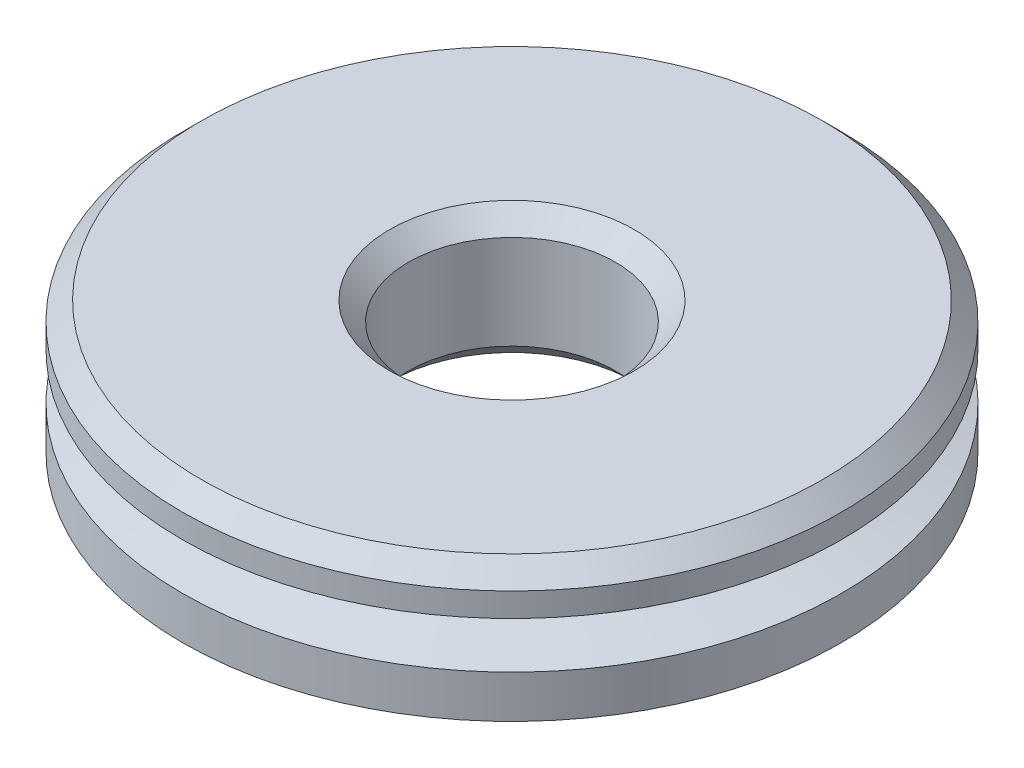
ISO-10303-21;
HEADER;
FILE_DESCRIPTION(('STEP AP214'),'2;1');
FILE_NAME('part.step','',(''),(''),'','','');
FILE_SCHEMA(('AUTOMOTIVE_DESIGN { 1 0 10303 214 1 1 1 1 }'));
ENDSEC;
DATA;
#1=APPLICATION_CONTEXT('core data for automotive mechanical design processes');
#2=APPLICATION_PROTOCOL_DEFINITION('international standard','automotive_design',2000,#1);
#3=PRODUCT_CONTEXT('',#1,'mechanical');
#4=PRODUCT('Part','Part','',(#3));
#5=PRODUCT_RELATED_PRODUCT_CATEGORY('part','',(#4));
#6=PRODUCT_DEFINITION_FORMATION('','',#4);
#7=PRODUCT_DEFINITION_CONTEXT('part definition',#1,'design');
#8=PRODUCT_DEFINITION('design','',#6,#7);
#9=PRODUCT_DEFINITION_SHAPE('','',#8);
#10=(LENGTH_UNIT() NAMED_UNIT(*) SI_UNIT(.MILLI.,.METRE.));
#11=(NAMED_UNIT(*) PLANE_ANGLE_UNIT() SI_UNIT($,.RADIAN.));
#12=(NAMED_UNIT(*) SI_UNIT($,.STERADIAN.) SOLID_ANGLE_UNIT());
#13=UNCERTAINTY_MEASURE_WITH_UNIT(LENGTH_MEASURE(1.E-05),#10,'distance_accuracy_value','');
#14=(GEOMETRIC_REPRESENTATION_CONTEXT(3) GLOBAL_UNCERTAINTY_ASSIGNED_CONTEXT((#13)) GLOBAL_UNIT_ASSIGNED_CONTEXT((#10,
#11,#12)) REPRESENTATION_CONTEXT('',''));
#15=CARTESIAN_POINT('',(0.,0.,0.));
#16=DIRECTION('',(0.,0.,1.));
#17=DIRECTION('',(1.,0.,0.));
#18=AXIS2_PLACEMENT_3D('',#15,#16,#17);
#19=CARTESIAN_POINT('',(-16.51,9.48098945053343,0.));
#20=DIRECTION('',(0.,1.,0.));
#21=DIRECTION('',(0.,0.,1.));
#22=AXIS2_PLACEMENT_3D('',#19,#20,#21);
#23=CONICAL_SURFACE('',#22,44.45,1.30899693899575);
#24=CARTESIAN_POINT('',(-16.51,6.35,0.));
#25=DIRECTION('',(0.,1.,0.));
#26=DIRECTION('',(0.,0.,1.));
#27=AXIS2_PLACEMENT_3D('',#24,#25,#26);
#28=CIRCLE('',#27,32.7649882926469);
#29=CARTESIAN_POINT('',(-16.51,6.35,32.7649882926469));
#30=VERTEX_POINT('',#29);
#31=EDGE_CURVE('E77',#30,#30,#28,.T.);
#32=ORIENTED_EDGE('',*,*,#31,.T.);
#33=EDGE_LOOP('',(#32));
#34=FACE_BOUND('',#33,.T.);
#35=CARTESIAN_POINT('',(-16.51,9.48098945053343,0.));
#36=DIRECTION('',(0.,1.,0.));
#37=DIRECTION('',(0.,0.,1.));
#38=AXIS2_PLACEMENT_3D('',#35,#36,#37);
#39=CIRCLE('',#38,44.45);
#40=CARTESIAN_POINT('',(-16.51,9.48098945053343,44.45));
#41=VERTEX_POINT('',#40);
#42=EDGE_CURVE('E68',#41,#41,#39,.T.);
#43=ORIENTED_EDGE('',*,*,#42,.F.);
#44=EDGE_LOOP('',(#43));
#45=FACE_BOUND('',#44,.T.);
#46=ADVANCED_FACE('F45',(#34,#45),#23,.T.);
#47=CARTESIAN_POINT('',(-16.51,12.7,0.));
#48=DIRECTION('',(0.,1.,0.));
#49=DIRECTION('',(0.,0.,1.));
#50=AXIS2_PLACEMENT_3D('',#47,#48,#49);
#51=CYLINDRICAL_SURFACE('',#50,44.45);
#52=CARTESIAN_POINT('',(-16.51,12.6999999999999,0.));
#53=DIRECTION('',(0.,-1.,0.));
#54=DIRECTION('',(0.,0.,-1.));
#55=AXIS2_PLACEMENT_3D('',#52,#53,#54);
#56=CIRCLE('',#55,44.45);
#57=CARTESIAN_POINT('',(-16.51,12.6999999999999,-44.45));
#58=VERTEX_POINT('',#57);
#59=EDGE_CURVE('E59',#58,#58,#56,.T.);
#60=ORIENTED_EDGE('',*,*,#59,.T.);
#61=EDGE_LOOP('',(#60));
#62=FACE_BOUND('',#61,.T.);
#63=ORIENTED_EDGE('',*,*,#42,.T.);
#64=EDGE_LOOP('',(#63));
#65=FACE_BOUND('',#64,.T.);
#66=ADVANCED_FACE('F153',(#62,#65),#51,.T.);
#67=CARTESIAN_POINT('',(0.,15.24,0.));
#68=DIRECTION('',(0.,-1.,0.));
#69=DIRECTION('',(0.,0.,-1.));
#70=AXIS2_PLACEMENT_3D('',#67,#68,#69);
#71=PLANE('',#70);
#72=CARTESIAN_POINT('',(-16.51,15.24,0.));
#73=DIRECTION('',(0.,-1.,0.));
#74=DIRECTION('',(0.,0.,-1.));
#75=AXIS2_PLACEMENT_3D('',#72,#73,#74);
#76=CIRCLE('',#75,41.9099999999999);
#77=CARTESIAN_POINT('',(-16.51,15.24,-41.9099999999999));
#78=VERTEX_POINT('',#77);
#79=EDGE_CURVE('E62',#78,#78,#76,.F.);
#80=ORIENTED_EDGE('',*,*,#79,.T.);
#81=EDGE_LOOP('',(#80));
#82=FACE_BOUND('',#81,.T.);
#83=CARTESIAN_POINT('',(-16.51,15.24,0.));
#84=DIRECTION('',(0.,-1.,0.));
#85=DIRECTION('',(0.,0.,-1.));
#86=AXIS2_PLACEMENT_3D('',#83,#84,#85);
#87=CIRCLE('',#86,16.51);
#88=CARTESIAN_POINT('',(-16.51,15.24,16.51));
#89=VERTEX_POINT('',#88);
#90=EDGE_CURVE('E66',#89,#89,#87,.T.);
#91=ORIENTED_EDGE('',*,*,#90,.T.);
#92=EDGE_LOOP('',(#91));
#93=FACE_BOUND('',#92,.T.);
#94=ADVANCED_FACE('F147',(#82,#93),#71,.F.);
#95=CARTESIAN_POINT('',(-16.51,12.7,0.));
#96=DIRECTION('',(0.,1.,0.));
#97=DIRECTION('',(0.,0.,1.));
#98=AXIS2_PLACEMENT_3D('',#95,#96,#97);
#99=CYLINDRICAL_SURFACE('',#98,13.97);
#100=CARTESIAN_POINT('',(-16.51,12.7,0.));
#101=DIRECTION('',(0.,-1.,0.));
#102=DIRECTION('',(0.,0.,-1.));
#103=AXIS2_PLACEMENT_3D('',#100,#101,#102);
#104=CIRCLE('',#103,13.97);
#105=CARTESIAN_POINT('',(-16.51,12.7,13.97));
#106=VERTEX_POINT('',#105);
#107=EDGE_CURVE('E49',#106,#106,#104,.F.);
#108=ORIENTED_EDGE('',*,*,#107,.T.);
#109=EDGE_LOOP('',(#108));
#110=FACE_BOUND('',#109,.T.);
#111=CARTESIAN_POINT('',(-16.51,0.,0.));
#112=DIRECTION('',(0.,1.,0.));
#113=DIRECTION('',(0.,0.,1.));
#114=AXIS2_PLACEMENT_3D('',#111,#112,#113);
#115=CIRCLE('',#114,13.97);
#116=CARTESIAN_POINT('',(-16.51,0.,13.97));
#117=VERTEX_POINT('',#116);
#118=EDGE_CURVE('E53',#117,#117,#115,.F.);
#119=ORIENTED_EDGE('',*,*,#118,.T.);
#120=EDGE_LOOP('',(#119));
#121=FACE_BOUND('',#120,.T.);
#122=ADVANCED_FACE('F150',(#110,#121),#99,.F.);
#123=CARTESIAN_POINT('',(0.,-2.54,0.));
#124=DIRECTION('',(0.,1.,0.));
#125=DIRECTION('',(0.,0.,1.));
#126=AXIS2_PLACEMENT_3D('',#123,#124,#125);
#127=PLANE('',#126);
#128=CARTESIAN_POINT('',(-16.51,-2.54,0.));
#129=DIRECTION('',(0.,1.,0.));
#130=DIRECTION('',(0.,0.,1.));
#131=AXIS2_PLACEMENT_3D('',#128,#129,#130);
#132=CIRCLE('',#131,16.51);
#133=CARTESIAN_POINT('',(-16.51,-2.54,16.51));
#134=VERTEX_POINT('',#133);
#135=EDGE_CURVE('E10',#134,#134,#132,.T.);
#136=ORIENTED_EDGE('',*,*,#135,.T.);
#137=EDGE_LOOP('',(#136));
#138=FACE_BOUND('',#137,.T.);
#139=CARTESIAN_POINT('',(-16.51,-2.54,0.));
#140=DIRECTION('',(0.,1.,0.));
#141=DIRECTION('',(0.,0.,1.));
#142=AXIS2_PLACEMENT_3D('',#139,#140,#141);
#143=CIRCLE('',#142,44.45);
#144=CARTESIAN_POINT('',(-16.51,-2.54,44.45));
#145=VERTEX_POINT('',#144);
#146=EDGE_CURVE('E75',#145,#145,#143,.T.);
#147=ORIENTED_EDGE('',*,*,#146,.F.);
#148=EDGE_LOOP('',(#147));
#149=FACE_BOUND('',#148,.T.);
#150=ADVANCED_FACE('F141',(#138,#149),#127,.F.);
#151=CARTESIAN_POINT('',(-16.51,12.7,0.));
#152=DIRECTION('',(0.,1.,0.));
#153=DIRECTION('',(0.,0.,1.));
#154=AXIS2_PLACEMENT_3D('',#151,#152,#153);
#155=CYLINDRICAL_SURFACE('',#154,44.45);
#156=ORIENTED_EDGE('',*,*,#146,.T.);
#157=EDGE_LOOP('',(#156));
#158=FACE_BOUND('',#157,.T.);
#159=CARTESIAN_POINT('',(-16.51,3.21901054946657,0.));
#160=DIRECTION('',(0.,1.,0.));
#161=DIRECTION('',(0.,0.,1.));
#162=AXIS2_PLACEMENT_3D('',#159,#160,#161);
#163=CIRCLE('',#162,44.45);
#164=CARTESIAN_POINT('',(-16.51,3.21901054946657,44.45));
#165=VERTEX_POINT('',#164);
#166=EDGE_CURVE('E73',#165,#165,#163,.T.);
#167=ORIENTED_EDGE('',*,*,#166,.F.);
#168=EDGE_LOOP('',(#167));
#169=FACE_BOUND('',#168,.T.);
#170=ADVANCED_FACE('F138',(#158,#169),#155,.T.);
#171=CARTESIAN_POINT('',(-16.51,6.35,0.));
#172=DIRECTION('',(0.,-1.,0.));
#173=DIRECTION('',(0.,0.,-1.));
#174=AXIS2_PLACEMENT_3D('',#171,#172,#173);
#175=CONICAL_SURFACE('',#174,32.7649882926469,1.30899693899575);
#176=ORIENTED_EDGE('',*,*,#166,.T.);
#177=EDGE_LOOP('',(#176));
#178=FACE_BOUND('',#177,.T.);
#179=ORIENTED_EDGE('',*,*,#31,.F.);
#180=EDGE_LOOP('',(#179));
#181=FACE_BOUND('',#180,.T.);
#182=ADVANCED_FACE('F131',(#178,#181),#175,.T.);
#183=CARTESIAN_POINT('',(-16.51,15.24,0.));
#184=DIRECTION('',(0.,-1.,0.));
#185=DIRECTION('',(0.,0.,-1.));
#186=AXIS2_PLACEMENT_3D('',#183,#184,#185);
#187=CONICAL_SURFACE('',#186,41.9099999999999,0.785398163397447);
#188=ORIENTED_EDGE('',*,*,#59,.F.);
#189=EDGE_LOOP('',(#188));
#190=FACE_BOUND('',#189,.T.);
#191=ORIENTED_EDGE('',*,*,#79,.F.);
#192=EDGE_LOOP('',(#191));
#193=FACE_BOUND('',#192,.T.);
#194=ADVANCED_FACE('F139',(#190,#193),#187,.T.);
#195=CARTESIAN_POINT('',(-16.51,12.7,0.));
#196=DIRECTION('',(0.,1.,0.));
#197=DIRECTION('',(0.,0.,1.));
#198=AXIS2_PLACEMENT_3D('',#195,#196,#197);
#199=CONICAL_SURFACE('',#198,13.97,0.785398163397448);
#200=CARTESIAN_POINT('',(-16.51,15.24,16.51));
#201=CARTESIAN_POINT('',(-16.51,15.2135416666667,16.4835416666666));
#202=CARTESIAN_POINT('',(-16.51,15.1870833333333,16.4570833333333));
#203=CARTESIAN_POINT('',(-16.51,15.1341666666667,16.4041666666667));
#204=CARTESIAN_POINT('',(-16.51,15.1077083333333,16.3777083333333));
#205=CARTESIAN_POINT('',(-16.51,15.0547916666667,16.3247916666667));
#206=CARTESIAN_POINT('',(-16.51,15.0283333333333,16.2983333333333));
#207=CARTESIAN_POINT('',(-16.51,14.9754166666667,16.2454166666666));
#208=CARTESIAN_POINT('',(-16.51,14.9489583333333,16.2189583333333));
#209=CARTESIAN_POINT('',(-16.51,14.8960416666667,16.1660416666667));
#210=CARTESIAN_POINT('',(-16.51,14.8695833333333,16.1395833333333));
#211=CARTESIAN_POINT('',(-16.51,14.8166666666667,16.0866666666667));
#212=CARTESIAN_POINT('',(-16.51,14.7902083333333,16.0602083333333));
#213=CARTESIAN_POINT('',(-16.51,14.7372916666667,16.0072916666667));
#214=CARTESIAN_POINT('',(-16.51,14.7108333333333,15.9808333333333));
#215=CARTESIAN_POINT('',(-16.51,14.6579166666667,15.9279166666667));
#216=CARTESIAN_POINT('',(-16.51,14.6314583333333,15.9014583333333));
#217=CARTESIAN_POINT('',(-16.51,14.5785416666667,15.8485416666667));
#218=CARTESIAN_POINT('',(-16.51,14.5520833333333,15.8220833333333));
#219=CARTESIAN_POINT('',(-16.51,14.4991666666667,15.7691666666667));
#220=CARTESIAN_POINT('',(-16.51,14.4727083333333,15.7427083333333));
#221=CARTESIAN_POINT('',(-16.51,14.4197916666667,15.6897916666667));
#222=CARTESIAN_POINT('',(-16.51,14.3933333333333,15.6633333333333));
#223=CARTESIAN_POINT('',(-16.51,14.3404166666667,15.6104166666667));
#224=CARTESIAN_POINT('',(-16.51,14.3139583333333,15.5839583333333));
#225=CARTESIAN_POINT('',(-16.51,14.2610416666667,15.5310416666667));
#226=CARTESIAN_POINT('',(-16.51,14.2345833333333,15.5045833333333));
#227=CARTESIAN_POINT('',(-16.51,14.1816666666667,15.4516666666667));
#228=CARTESIAN_POINT('',(-16.51,14.1552083333333,15.4252083333333));
#229=CARTESIAN_POINT('',(-16.51,14.1022916666667,15.3722916666667));
#230=CARTESIAN_POINT('',(-16.51,14.0758333333333,15.3458333333333));
#231=CARTESIAN_POINT('',(-16.51,14.0229166666667,15.2929166666667));
#232=CARTESIAN_POINT('',(-16.51,13.9964583333333,15.2664583333333));
#233=CARTESIAN_POINT('',(-16.51,13.9435416666667,15.2135416666667));
#234=CARTESIAN_POINT('',(-16.51,13.9170833333333,15.1870833333333));
#235=CARTESIAN_POINT('',(-16.51,13.8641666666667,15.1341666666667));
#236=CARTESIAN_POINT('',(-16.51,13.8377083333333,15.1077083333333));
#237=CARTESIAN_POINT('',(-16.51,13.7847916666667,15.0547916666667));
#238=CARTESIAN_POINT('',(-16.51,13.7583333333333,15.0283333333333));
#239=CARTESIAN_POINT('',(-16.51,13.7054166666667,14.9754166666667));
#240=CARTESIAN_POINT('',(-16.51,13.6789583333333,14.9489583333333));
#241=CARTESIAN_POINT('',(-16.51,13.6260416666667,14.8960416666667));
#242=CARTESIAN_POINT('',(-16.51,13.5995833333333,14.8695833333333));
#243=CARTESIAN_POINT('',(-16.51,13.5466666666667,14.8166666666667));
#244=CARTESIAN_POINT('',(-16.51,13.5202083333333,14.7902083333333));
#245=CARTESIAN_POINT('',(-16.51,13.4672916666667,14.7372916666667));
#246=CARTESIAN_POINT('',(-16.51,13.4408333333333,14.7108333333333));
#247=CARTESIAN_POINT('',(-16.51,13.3879166666667,14.6579166666667));
#248=CARTESIAN_POINT('',(-16.51,13.3614583333333,14.6314583333333));
#249=CARTESIAN_POINT('',(-16.51,13.3085416666667,14.5785416666667));
#250=CARTESIAN_POINT('',(-16.51,13.2820833333333,14.5520833333333));
#251=CARTESIAN_POINT('',(-16.51,13.2291666666667,14.4991666666667));
#252=CARTESIAN_POINT('',(-16.51,13.2027083333333,14.4727083333333));
#253=CARTESIAN_POINT('',(-16.51,13.1497916666667,14.4197916666667));
#254=CARTESIAN_POINT('',(-16.51,13.1233333333333,14.3933333333333));
#255=CARTESIAN_POINT('',(-16.51,13.0704166666667,14.3404166666667));
#256=CARTESIAN_POINT('',(-16.51,13.0439583333333,14.3139583333333));
#257=CARTESIAN_POINT('',(-16.51,12.9910416666667,14.2610416666667));
#258=CARTESIAN_POINT('',(-16.51,12.9645833333333,14.2345833333333));
#259=CARTESIAN_POINT('',(-16.51,12.9116666666667,14.1816666666667));
#260=CARTESIAN_POINT('',(-16.51,12.8852083333333,14.1552083333333));
#261=CARTESIAN_POINT('',(-16.51,12.8322916666667,14.1022916666667));
#262=CARTESIAN_POINT('',(-16.51,12.8058333333333,14.0758333333333));
#263=CARTESIAN_POINT('',(-16.51,12.7529166666667,14.0229166666667));
#264=CARTESIAN_POINT('',(-16.51,12.7264583333333,13.9964583333333));
#265=CARTESIAN_POINT('',(-16.51,12.7,13.97));
#266=B_SPLINE_CURVE_WITH_KNOTS('',3,(#200,#201,#202,#203,#204,#205,#206,#207,#208,#209,#210,
#211,#212,#213,#214,#215,#216,#217,#218,#219,#220,#221,#222,#223,#224,#225,#226,#227,#228,#229,
#230,#231,#232,#233,#234,#235,#236,#237,#238,#239,#240,#241,#242,#243,#244,#245,#246,#247,#248,
#249,#250,#251,#252,#253,#254,#255,#256,#257,#258,#259,#260,#261,#262,#263,#264,#265),
.UNSPECIFIED.,.F.,.F.,(4,2,2,2,2,2,2,2,2,2,2,2,2,2,2,2,2,2,2,2,2,2,2,2,2,2,2,2,2,2,2,2,4),(0.,
0.112253201513364,0.224506403026728,0.33675960454009,0.449012806053454,0.561266007566818,
0.673519209080182,0.785772410593546,0.898025612106909,1.01027881362027,1.12253201513363,
1.234785216647,1.34703841816036,1.45929161967373,1.57154482118709,1.68379802270045,
1.79605122421382,1.90830442572718,2.02055762724054,2.13281082875391,2.24506403026727,
2.35731723178064,2.469570433294,2.58182363480736,2.69407683632073,2.80633003783409,
2.91858323934745,3.03083644086082,3.14308964237418,3.25534284388755,3.36759604540091,
3.47984924691427,3.59210244842764),.UNSPECIFIED.);
#267=EDGE_CURVE('BSEAM167',#89,#106,#266,.T.);
#268=ORIENTED_EDGE('',*,*,#90,.F.);
#269=ORIENTED_EDGE('',*,*,#107,.F.);
#270=ORIENTED_EDGE('',*,*,#267,.T.);
#271=ORIENTED_EDGE('',*,*,#267,.F.);
#272=EDGE_LOOP('',(#268,#270,#269,#271));
#273=FACE_BOUND('',#272,.T.);
#274=ADVANCED_FACE('F167',(#273),#199,.F.);
#275=CARTESIAN_POINT('',(-16.51,-2.54,0.));
#276=DIRECTION('',(0.,-1.,0.));
#277=DIRECTION('',(0.,0.,-1.));
#278=AXIS2_PLACEMENT_3D('',#275,#276,#277);
#279=CONICAL_SURFACE('',#278,16.51,0.78539816339745);
#280=ORIENTED_EDGE('',*,*,#118,.F.);
#281=EDGE_LOOP('',(#280));
#282=FACE_BOUND('',#281,.T.);
#283=ORIENTED_EDGE('',*,*,#135,.F.);
#284=EDGE_LOOP('',(#283));
#285=FACE_BOUND('',#284,.T.);
#286=ADVANCED_FACE('F44',(#282,#285),#279,.F.);
#287=CLOSED_SHELL('',(#46,#66,#94,#122,#150,#170,#182,#194,#274,#286));
#288=CARTESIAN_POINT('',(-16.51,11.43,0.));
#289=DIRECTION('',(0.,1.,0.));
#290=DIRECTION('',(0.,0.,1.));
#291=AXIS2_PLACEMENT_3D('',#288,#289,#290);
#292=CONICAL_SURFACE('',#291,41.91,1.30899693899575);
#293=CARTESIAN_POINT('',(-16.51,8.80345159877424,0.));
#294=DIRECTION('',(0.,1.,0.));
#295=DIRECTION('',(0.,0.,1.));
#296=AXIS2_PLACEMENT_3D('',#293,#294,#295);
#297=CIRCLE('',#296,32.1075879180865);
#298=CARTESIAN_POINT('',(-16.51,8.80345159877424,32.1075879180865));
#299=VERTEX_POINT('',#298);
#300=EDGE_CURVE('E105',#299,#299,#297,.T.);
#301=ORIENTED_EDGE('',*,*,#300,.F.);
#302=EDGE_LOOP('',(#301));
#303=FACE_BOUND('',#302,.T.);
#304=CARTESIAN_POINT('',(-16.51,11.43,0.));
#305=DIRECTION('',(0.,1.,0.));
#306=DIRECTION('',(0.,0.,1.));
#307=AXIS2_PLACEMENT_3D('',#304,#305,#306);
#308=CIRCLE('',#307,41.91);
#309=CARTESIAN_POINT('',(-16.51,11.43,41.91));
#310=VERTEX_POINT('',#309);
#311=EDGE_CURVE('E81',#310,#310,#308,.T.);
#312=ORIENTED_EDGE('',*,*,#311,.T.);
#313=EDGE_LOOP('',(#312));
#314=FACE_BOUND('',#313,.T.);
#315=ADVANCED_FACE('F107',(#303,#314),#292,.F.);
#316=CARTESIAN_POINT('',(-16.51,12.7,0.));
#317=DIRECTION('',(0.,1.,0.));
#318=DIRECTION('',(0.,0.,1.));
#319=AXIS2_PLACEMENT_3D('',#316,#317,#318);
#320=CYLINDRICAL_SURFACE('',#319,41.91);
#321=ORIENTED_EDGE('',*,*,#311,.F.);
#322=EDGE_LOOP('',(#321));
#323=FACE_BOUND('',#322,.T.);
#324=CARTESIAN_POINT('',(-16.51,12.7,0.));
#325=DIRECTION('',(0.,1.,0.));
#326=DIRECTION('',(0.,0.,1.));
#327=AXIS2_PLACEMENT_3D('',#324,#325,#326);
#328=CIRCLE('',#327,41.91);
#329=CARTESIAN_POINT('',(-16.51,12.7,41.91));
#330=VERTEX_POINT('',#329);
#331=EDGE_CURVE('E83',#330,#330,#328,.T.);
#332=ORIENTED_EDGE('',*,*,#331,.T.);
#333=EDGE_LOOP('',(#332));
#334=FACE_BOUND('',#333,.T.);
#335=ADVANCED_FACE('F112',(#323,#334),#320,.F.);
#336=CARTESIAN_POINT('',(0.,12.7,0.));
#337=DIRECTION('',(0.,-1.,0.));
#338=DIRECTION('',(0.,0.,-1.));
#339=AXIS2_PLACEMENT_3D('',#336,#337,#338);
#340=PLANE('',#339);
#341=CARTESIAN_POINT('',(-16.51,12.7,0.));
#342=DIRECTION('',(0.,1.,0.));
#343=DIRECTION('',(0.,0.,1.));
#344=AXIS2_PLACEMENT_3D('',#341,#342,#343);
#345=CIRCLE('',#344,16.51);
#346=CARTESIAN_POINT('',(-16.51,12.7,16.51));
#347=VERTEX_POINT('',#346);
#348=EDGE_CURVE('E87',#347,#347,#345,.T.);
#349=ORIENTED_EDGE('',*,*,#348,.T.);
#350=EDGE_LOOP('',(#349));
#351=FACE_BOUND('',#350,.T.);
#352=ORIENTED_EDGE('',*,*,#331,.F.);
#353=EDGE_LOOP('',(#352));
#354=FACE_BOUND('',#353,.T.);
#355=ADVANCED_FACE('F117',(#351,#354),#340,.T.);
#356=CARTESIAN_POINT('',(-16.51,12.7,0.));
#357=DIRECTION('',(0.,1.,0.));
#358=DIRECTION('',(0.,0.,1.));
#359=AXIS2_PLACEMENT_3D('',#356,#357,#358);
#360=CYLINDRICAL_SURFACE('',#359,16.51);
#361=CARTESIAN_POINT('',(-16.51,0.,0.));
#362=DIRECTION('',(0.,1.,0.));
#363=DIRECTION('',(0.,0.,1.));
#364=AXIS2_PLACEMENT_3D('',#361,#362,#363);
#365=CIRCLE('',#364,16.51);
#366=CARTESIAN_POINT('',(-16.51,0.,16.51));
#367=VERTEX_POINT('',#366);
#368=EDGE_CURVE('E89',#367,#367,#365,.T.);
#369=ORIENTED_EDGE('',*,*,#368,.T.);
#370=EDGE_LOOP('',(#369));
#371=FACE_BOUND('',#370,.T.);
#372=ORIENTED_EDGE('',*,*,#348,.F.);
#373=EDGE_LOOP('',(#372));
#374=FACE_BOUND('',#373,.T.);
#375=ADVANCED_FACE('F124',(#371,#374),#360,.T.);
#376=CARTESIAN_POINT('',(0.,0.,0.));
#377=DIRECTION('',(0.,1.,0.));
#378=DIRECTION('',(0.,0.,1.));
#379=AXIS2_PLACEMENT_3D('',#376,#377,#378);
#380=PLANE('',#379);
#381=CARTESIAN_POINT('',(-16.51,0.,0.));
#382=DIRECTION('',(0.,1.,0.));
#383=DIRECTION('',(0.,0.,1.));
#384=AXIS2_PLACEMENT_3D('',#381,#382,#383);
#385=CIRCLE('',#384,41.91);
#386=CARTESIAN_POINT('',(-16.51,0.,41.91));
#387=VERTEX_POINT('',#386);
#388=EDGE_CURVE('E91',#387,#387,#385,.T.);
#389=ORIENTED_EDGE('',*,*,#388,.T.);
#390=EDGE_LOOP('',(#389));
#391=FACE_BOUND('',#390,.T.);
#392=ORIENTED_EDGE('',*,*,#368,.F.);
#393=EDGE_LOOP('',(#392));
#394=FACE_BOUND('',#393,.T.);
#395=ADVANCED_FACE('F129',(#391,#394),#380,.T.);
#396=CARTESIAN_POINT('',(-16.51,12.7,0.));
#397=DIRECTION('',(0.,1.,0.));
#398=DIRECTION('',(0.,0.,1.));
#399=AXIS2_PLACEMENT_3D('',#396,#397,#398);
#400=CYLINDRICAL_SURFACE('',#399,41.91);
#401=ORIENTED_EDGE('',*,*,#388,.F.);
#402=EDGE_LOOP('',(#401));
#403=FACE_BOUND('',#402,.T.);
#404=CARTESIAN_POINT('',(-16.51,1.27,0.));
#405=DIRECTION('',(0.,1.,0.));
#406=DIRECTION('',(0.,0.,1.));
#407=AXIS2_PLACEMENT_3D('',#404,#405,#406);
#408=CIRCLE('',#407,41.91);
#409=CARTESIAN_POINT('',(-16.51,1.27,41.91));
#410=VERTEX_POINT('',#409);
#411=EDGE_CURVE('E96',#410,#410,#408,.T.);
#412=ORIENTED_EDGE('',*,*,#411,.T.);
#413=EDGE_LOOP('',(#412));
#414=FACE_BOUND('',#413,.T.);
#415=ADVANCED_FACE('F212',(#403,#414),#400,.F.);
#416=CARTESIAN_POINT('',(-16.51,3.89654840122576,0.));
#417=DIRECTION('',(0.,-1.,0.));
#418=DIRECTION('',(0.,0.,-1.));
#419=AXIS2_PLACEMENT_3D('',#416,#417,#418);
#420=CONICAL_SURFACE('',#419,32.1075879180865,1.30899693899575);
#421=ORIENTED_EDGE('',*,*,#411,.F.);
#422=EDGE_LOOP('',(#421));
#423=FACE_BOUND('',#422,.T.);
#424=CARTESIAN_POINT('',(-16.51,3.89654840122576,0.));
#425=DIRECTION('',(0.,1.,0.));
#426=DIRECTION('',(0.,0.,1.));
#427=AXIS2_PLACEMENT_3D('',#424,#425,#426);
#428=CIRCLE('',#427,32.1075879180865);
#429=CARTESIAN_POINT('',(-16.51,3.89654840122576,32.1075879180865));
#430=VERTEX_POINT('',#429);
#431=EDGE_CURVE('E97',#430,#430,#428,.T.);
#432=ORIENTED_EDGE('',*,*,#431,.T.);
#433=EDGE_LOOP('',(#432));
#434=FACE_BOUND('',#433,.T.);
#435=ADVANCED_FACE('F204',(#423,#434),#420,.F.);
#436=CARTESIAN_POINT('',(-16.51,6.35,0.));
#437=DIRECTION('',(0.,1.,0.));
#438=DIRECTION('',(0.,0.,1.));
#439=AXIS2_PLACEMENT_3D('',#436,#437,#438);
#440=TOROIDAL_SURFACE('',#439,32.7649882926469,2.54);
#441=ORIENTED_EDGE('',*,*,#431,.F.);
#442=EDGE_LOOP('',(#441));
#443=FACE_BOUND('',#442,.T.);
#444=ORIENTED_EDGE('',*,*,#300,.T.);
#445=EDGE_LOOP('',(#444));
#446=FACE_BOUND('',#445,.T.);
#447=ADVANCED_FACE('F106',(#443,#446),#440,.T.);
#448=CLOSED_SHELL('',(#315,#335,#355,#375,#395,#415,#435,#447));
#449=ORIENTED_CLOSED_SHELL('',*,#448,.T.);
#450=BREP_WITH_VOIDS('B2',#287,(#449));
#451=ADVANCED_BREP_SHAPE_REPRESENTATION('',(#18,#450),#14);
#452=SHAPE_DEFINITION_REPRESENTATION(#9,#451);
ENDSEC;
END-ISO-10303-21;
